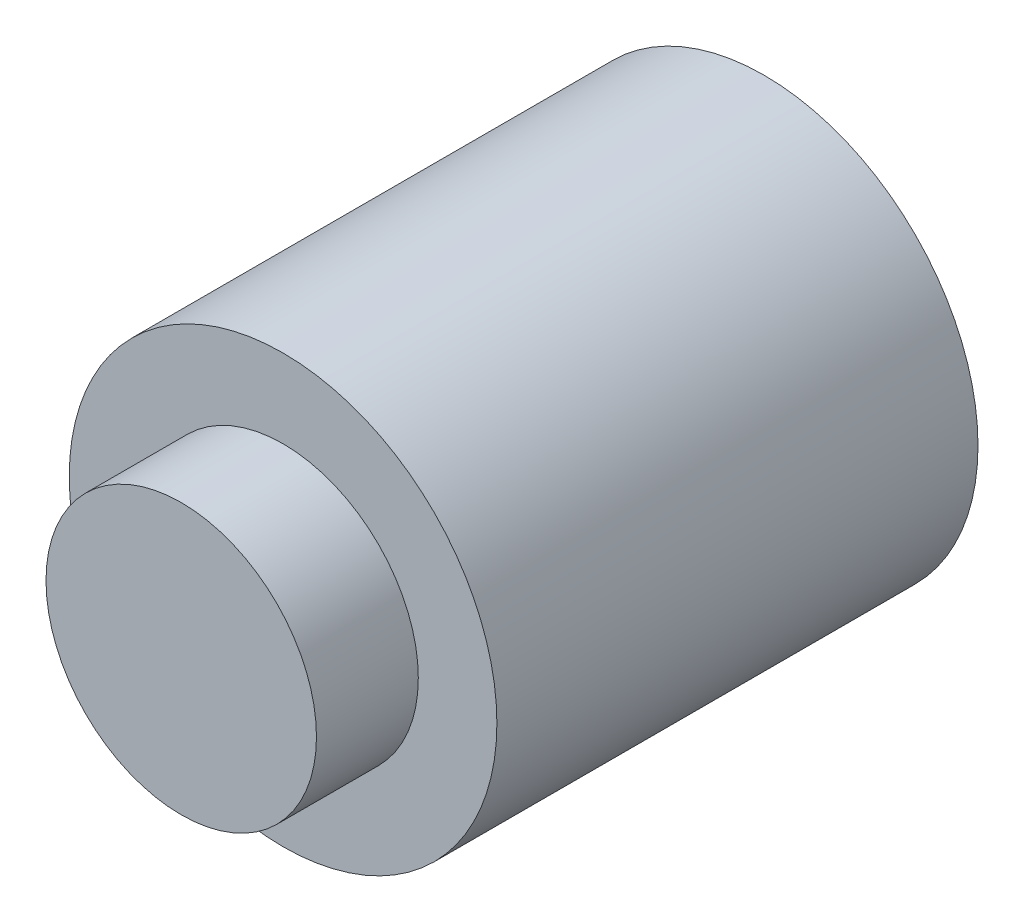
ISO-10303-21;
HEADER;
FILE_DESCRIPTION(('STEP AP214'),'2;1');
FILE_NAME('part.step','',(''),(''),'','','');
FILE_SCHEMA(('AUTOMOTIVE_DESIGN { 1 0 10303 214 1 1 1 1 }'));
ENDSEC;
DATA;
#1=APPLICATION_CONTEXT('core data for automotive mechanical design processes');
#2=APPLICATION_PROTOCOL_DEFINITION('international standard','automotive_design',2000,#1);
#3=PRODUCT_CONTEXT('',#1,'mechanical');
#4=PRODUCT('Part','Part','',(#3));
#5=PRODUCT_RELATED_PRODUCT_CATEGORY('part','',(#4));
#6=PRODUCT_DEFINITION_FORMATION('','',#4);
#7=PRODUCT_DEFINITION_CONTEXT('part definition',#1,'design');
#8=PRODUCT_DEFINITION('design','',#6,#7);
#9=PRODUCT_DEFINITION_SHAPE('','',#8);
#10=(LENGTH_UNIT() NAMED_UNIT(*) SI_UNIT(.MILLI.,.METRE.));
#11=(NAMED_UNIT(*) PLANE_ANGLE_UNIT() SI_UNIT($,.RADIAN.));
#12=(NAMED_UNIT(*) SI_UNIT($,.STERADIAN.) SOLID_ANGLE_UNIT());
#13=UNCERTAINTY_MEASURE_WITH_UNIT(LENGTH_MEASURE(1.E-05),#10,'distance_accuracy_value','');
#14=(GEOMETRIC_REPRESENTATION_CONTEXT(3) GLOBAL_UNCERTAINTY_ASSIGNED_CONTEXT((#13)) GLOBAL_UNIT_ASSIGNED_CONTEXT((#10,
#11,#12)) REPRESENTATION_CONTEXT('',''));
#15=CARTESIAN_POINT('',(0.,0.,0.));
#16=DIRECTION('',(0.,0.,1.));
#17=DIRECTION('',(1.,0.,0.));
#18=AXIS2_PLACEMENT_3D('',#15,#16,#17);
#19=CARTESIAN_POINT('',(0.,0.,0.));
#20=DIRECTION('',(0.,0.,1.));
#21=DIRECTION('',(0.,-1.,0.));
#22=AXIS2_PLACEMENT_3D('',#19,#20,#21);
#23=PLANE('',#22);
#24=CARTESIAN_POINT('',(0.,0.,0.));
#25=DIRECTION('',(0.,0.,-1.));
#26=DIRECTION('',(0.,1.,0.));
#27=AXIS2_PLACEMENT_3D('',#24,#25,#26);
#28=CIRCLE('',#27,12.6492);
#29=CARTESIAN_POINT('',(0.,12.6492,0.));
#30=VERTEX_POINT('',#29);
#31=EDGE_CURVE('E11',#30,#30,#28,.T.);
#32=ORIENTED_EDGE('',*,*,#31,.F.);
#33=EDGE_LOOP('',(#32));
#34=FACE_BOUND('',#33,.T.);
#35=ADVANCED_FACE('F50',(#34),#23,.T.);
#36=CARTESIAN_POINT('',(0.,0.,-19.525));
#37=DIRECTION('',(0.,0.,-1.));
#38=DIRECTION('',(0.,1.,0.));
#39=AXIS2_PLACEMENT_3D('',#36,#37,#38);
#40=CYLINDRICAL_SURFACE('',#39,12.6492);
#41=ORIENTED_EDGE('',*,*,#31,.T.);
#42=EDGE_LOOP('',(#41));
#43=FACE_BOUND('',#42,.T.);
#44=CARTESIAN_POINT('',(0.,0.,-9.525));
#45=DIRECTION('',(0.,0.,-1.));
#46=DIRECTION('',(0.,1.,0.));
#47=AXIS2_PLACEMENT_3D('',#44,#45,#46);
#48=CIRCLE('',#47,12.6492);
#49=CARTESIAN_POINT('',(0.,12.6492,-9.525));
#50=VERTEX_POINT('',#49);
#51=EDGE_CURVE('E58',#50,#50,#48,.T.);
#52=ORIENTED_EDGE('',*,*,#51,.F.);
#53=EDGE_LOOP('',(#52));
#54=FACE_BOUND('',#53,.T.);
#55=ADVANCED_FACE('F138',(#43,#54),#40,.T.);
#56=CARTESIAN_POINT('',(0.,12.6492,-9.525));
#57=DIRECTION('',(0.,0.,1.));
#58=DIRECTION('',(0.,-1.,0.));
#59=AXIS2_PLACEMENT_3D('',#56,#57,#58);
#60=PLANE('',#59);
#61=ORIENTED_EDGE('',*,*,#51,.T.);
#62=EDGE_LOOP('',(#61));
#63=FACE_BOUND('',#62,.T.);
#64=CARTESIAN_POINT('',(0.,0.,-9.525));
#65=DIRECTION('',(0.,0.,-1.));
#66=DIRECTION('',(0.,1.,0.));
#67=AXIS2_PLACEMENT_3D('',#64,#65,#66);
#68=CIRCLE('',#67,20.);
#69=CARTESIAN_POINT('',(0.,20.,-9.525));
#70=VERTEX_POINT('',#69);
#71=EDGE_CURVE('E128',#70,#70,#68,.T.);
#72=ORIENTED_EDGE('',*,*,#71,.F.);
#73=EDGE_LOOP('',(#72));
#74=FACE_BOUND('',#73,.T.);
#75=ADVANCED_FACE('F135',(#63,#74),#60,.T.);
#76=CARTESIAN_POINT('',(0.,0.,-19.525));
#77=DIRECTION('',(0.,0.,-1.));
#78=DIRECTION('',(0.,1.,0.));
#79=AXIS2_PLACEMENT_3D('',#76,#77,#78);
#80=CYLINDRICAL_SURFACE('',#79,20.);
#81=ORIENTED_EDGE('',*,*,#71,.T.);
#82=EDGE_LOOP('',(#81));
#83=FACE_BOUND('',#82,.T.);
#84=CARTESIAN_POINT('',(0.,0.,-54.525));
#85=DIRECTION('',(0.,0.,-1.));
#86=DIRECTION('',(0.,1.,0.));
#87=AXIS2_PLACEMENT_3D('',#84,#85,#86);
#88=CIRCLE('',#87,20.);
#89=CARTESIAN_POINT('',(0.,20.,-54.525));
#90=VERTEX_POINT('',#89);
#91=EDGE_CURVE('E124',#90,#90,#88,.T.);
#92=ORIENTED_EDGE('',*,*,#91,.F.);
#93=EDGE_LOOP('',(#92));
#94=FACE_BOUND('',#93,.T.);
#95=ADVANCED_FACE('F145',(#83,#94),#80,.T.);
#96=CARTESIAN_POINT('',(0.,20.,-54.525));
#97=DIRECTION('',(0.,0.,-1.));
#98=DIRECTION('',(0.,1.,0.));
#99=AXIS2_PLACEMENT_3D('',#96,#97,#98);
#100=PLANE('',#99);
#101=CARTESIAN_POINT('',(-0.223849370894547,16.8260110456742,-54.525));
#102=DIRECTION('',(0.,0.,-1.));
#103=DIRECTION('',(0.,1.,0.));
#104=AXIS2_PLACEMENT_3D('',#101,#102,#103);
#105=CIRCLE('',#104,1.13029999999999);
#106=CARTESIAN_POINT('',(-0.223849370894547,17.9563110456742,-54.525));
#107=VERTEX_POINT('',#106);
#108=EDGE_CURVE('E83',#107,#107,#105,.T.);
#109=ORIENTED_EDGE('',*,*,#108,.F.);
#110=EDGE_LOOP('',(#109));
#111=FACE_BOUND('',#110,.T.);
#112=CARTESIAN_POINT('',(0.,-16.8275,-54.525));
#113=DIRECTION('',(0.,0.,-1.));
#114=DIRECTION('',(0.,1.,0.));
#115=AXIS2_PLACEMENT_3D('',#112,#113,#114);
#116=CIRCLE('',#115,1.13029999999999);
#117=CARTESIAN_POINT('',(0.,-15.6972,-54.525));
#118=VERTEX_POINT('',#117);
#119=EDGE_CURVE('E82',#118,#118,#116,.T.);
#120=ORIENTED_EDGE('',*,*,#119,.F.);
#121=EDGE_LOOP('',(#120));
#122=FACE_BOUND('',#121,.T.);
#123=CARTESIAN_POINT('',(16.8275,0.,-54.525));
#124=DIRECTION('',(0.,0.,-1.));
#125=DIRECTION('',(0.,1.,0.));
#126=AXIS2_PLACEMENT_3D('',#123,#124,#125);
#127=CIRCLE('',#126,1.13029999999999);
#128=CARTESIAN_POINT('',(16.8275,1.13029999999999,-54.525));
#129=VERTEX_POINT('',#128);
#130=EDGE_CURVE('E96',#129,#129,#127,.T.);
#131=ORIENTED_EDGE('',*,*,#130,.F.);
#132=EDGE_LOOP('',(#131));
#133=FACE_BOUND('',#132,.T.);
#134=CARTESIAN_POINT('',(-16.8275,0.,-54.525));
#135=DIRECTION('',(0.,0.,-1.));
#136=DIRECTION('',(0.,1.,0.));
#137=AXIS2_PLACEMENT_3D('',#134,#135,#136);
#138=CIRCLE('',#137,1.13029999999999);
#139=CARTESIAN_POINT('',(-16.8275,1.13029999999999,-54.525));
#140=VERTEX_POINT('',#139);
#141=EDGE_CURVE('E104',#140,#140,#138,.T.);
#142=ORIENTED_EDGE('',*,*,#141,.F.);
#143=EDGE_LOOP('',(#142));
#144=FACE_BOUND('',#143,.T.);
#145=ORIENTED_EDGE('',*,*,#91,.T.);
#146=EDGE_LOOP('',(#145));
#147=FACE_BOUND('',#146,.T.);
#148=CARTESIAN_POINT('',(0.,0.,-54.525));
#149=DIRECTION('',(0.,0.,-1.));
#150=DIRECTION('',(0.,1.,0.));
#151=AXIS2_PLACEMENT_3D('',#148,#149,#150);
#152=CIRCLE('',#151,13.8867513459481);
#153=CARTESIAN_POINT('',(0.,13.8867513459481,-54.525));
#154=VERTEX_POINT('',#153);
#155=EDGE_CURVE('E120',#154,#154,#152,.T.);
#156=ORIENTED_EDGE('',*,*,#155,.F.);
#157=EDGE_LOOP('',(#156));
#158=FACE_BOUND('',#157,.T.);
#159=ADVANCED_FACE('F151',(#111,#122,#133,#144,#147,#158),#100,.T.);
#160=CARTESIAN_POINT('',(0.,0.,-49.525));
#161=DIRECTION('',(0.,0.,-1.));
#162=DIRECTION('',(0.,1.,0.));
#163=AXIS2_PLACEMENT_3D('',#160,#161,#162);
#164=CONICAL_SURFACE('',#163,11.,0.523598775598298);
#165=ORIENTED_EDGE('',*,*,#155,.T.);
#166=EDGE_LOOP('',(#165));
#167=FACE_BOUND('',#166,.T.);
#168=CARTESIAN_POINT('',(0.,0.,-49.525));
#169=DIRECTION('',(0.,0.,-1.));
#170=DIRECTION('',(0.,1.,0.));
#171=AXIS2_PLACEMENT_3D('',#168,#169,#170);
#172=CIRCLE('',#171,11.);
#173=CARTESIAN_POINT('',(0.,11.,-49.525));
#174=VERTEX_POINT('',#173);
#175=EDGE_CURVE('E116',#174,#174,#172,.T.);
#176=ORIENTED_EDGE('',*,*,#175,.F.);
#177=EDGE_LOOP('',(#176));
#178=FACE_BOUND('',#177,.T.);
#179=ADVANCED_FACE('F155',(#167,#178),#164,.F.);
#180=CARTESIAN_POINT('',(0.,0.,-19.525));
#181=DIRECTION('',(0.,0.,-1.));
#182=DIRECTION('',(0.,1.,0.));
#183=AXIS2_PLACEMENT_3D('',#180,#181,#182);
#184=CYLINDRICAL_SURFACE('',#183,11.);
#185=ORIENTED_EDGE('',*,*,#175,.T.);
#186=EDGE_LOOP('',(#185));
#187=FACE_BOUND('',#186,.T.);
#188=CARTESIAN_POINT('',(0.,0.,-19.525));
#189=DIRECTION('',(0.,0.,-1.));
#190=DIRECTION('',(0.,1.,0.));
#191=AXIS2_PLACEMENT_3D('',#188,#189,#190);
#192=CIRCLE('',#191,11.);
#193=CARTESIAN_POINT('',(0.,11.,-19.525));
#194=VERTEX_POINT('',#193);
#195=EDGE_CURVE('E112',#194,#194,#192,.T.);
#196=ORIENTED_EDGE('',*,*,#195,.F.);
#197=EDGE_LOOP('',(#196));
#198=FACE_BOUND('',#197,.T.);
#199=ADVANCED_FACE('F159',(#187,#198),#184,.F.);
#200=CARTESIAN_POINT('',(0.,11.,-19.525));
#201=DIRECTION('',(0.,0.,-1.));
#202=DIRECTION('',(0.,1.,0.));
#203=AXIS2_PLACEMENT_3D('',#200,#201,#202);
#204=PLANE('',#203);
#205=ORIENTED_EDGE('',*,*,#195,.T.);
#206=EDGE_LOOP('',(#205));
#207=FACE_BOUND('',#206,.T.);
#208=ADVANCED_FACE('F163',(#207),#204,.T.);
#209=CARTESIAN_POINT('',(-16.8275,0.,-45.));
#210=DIRECTION('',(0.,0.,-1.));
#211=DIRECTION('',(0.,1.,0.));
#212=AXIS2_PLACEMENT_3D('',#209,#210,#211);
#213=CONICAL_SURFACE('',#212,1.1303,1.02974425867665);
#214=CARTESIAN_POINT('',(-16.8275,0.,-44.3208472423131));
#215=VERTEX_POINT('',#214);
#216=VERTEX_LOOP('',#215);
#217=FACE_BOUND('',#216,.T.);
#218=CARTESIAN_POINT('',(-16.8275,0.,-45.));
#219=DIRECTION('',(0.,0.,-1.));
#220=DIRECTION('',(0.,1.,0.));
#221=AXIS2_PLACEMENT_3D('',#218,#219,#220);
#222=CIRCLE('',#221,1.1303);
#223=CARTESIAN_POINT('',(-16.8275,1.1303,-45.));
#224=VERTEX_POINT('',#223);
#225=EDGE_CURVE('E108',#224,#224,#222,.T.);
#226=ORIENTED_EDGE('',*,*,#225,.T.);
#227=EDGE_LOOP('',(#226));
#228=FACE_BOUND('',#227,.T.);
#229=ADVANCED_FACE('F167',(#217,#228),#213,.F.);
#230=CARTESIAN_POINT('',(-16.8275,0.,-54.525));
#231=DIRECTION('',(0.,0.,-1.));
#232=DIRECTION('',(0.,1.,0.));
#233=AXIS2_PLACEMENT_3D('',#230,#231,#232);
#234=CYLINDRICAL_SURFACE('',#233,1.13029999999999);
#235=ORIENTED_EDGE('',*,*,#225,.F.);
#236=EDGE_LOOP('',(#235));
#237=FACE_BOUND('',#236,.T.);
#238=ORIENTED_EDGE('',*,*,#141,.T.);
#239=EDGE_LOOP('',(#238));
#240=FACE_BOUND('',#239,.T.);
#241=ADVANCED_FACE('F171',(#237,#240),#234,.F.);
#242=CARTESIAN_POINT('',(16.8275,0.,-45.));
#243=DIRECTION('',(0.,0.,-1.));
#244=DIRECTION('',(0.,1.,0.));
#245=AXIS2_PLACEMENT_3D('',#242,#243,#244);
#246=CONICAL_SURFACE('',#245,1.1303,1.02974425867665);
#247=CARTESIAN_POINT('',(16.8275,0.,-44.3208472423131));
#248=VERTEX_POINT('',#247);
#249=VERTEX_LOOP('',#248);
#250=FACE_BOUND('',#249,.T.);
#251=CARTESIAN_POINT('',(16.8275,0.,-45.));
#252=DIRECTION('',(0.,0.,-1.));
#253=DIRECTION('',(0.,1.,0.));
#254=AXIS2_PLACEMENT_3D('',#251,#252,#253);
#255=CIRCLE('',#254,1.1303);
#256=CARTESIAN_POINT('',(16.8275,1.1303,-45.));
#257=VERTEX_POINT('',#256);
#258=EDGE_CURVE('E100',#257,#257,#255,.T.);
#259=ORIENTED_EDGE('',*,*,#258,.T.);
#260=EDGE_LOOP('',(#259));
#261=FACE_BOUND('',#260,.T.);
#262=ADVANCED_FACE('F174',(#250,#261),#246,.F.);
#263=CARTESIAN_POINT('',(16.8275,0.,-54.525));
#264=DIRECTION('',(0.,0.,-1.));
#265=DIRECTION('',(0.,1.,0.));
#266=AXIS2_PLACEMENT_3D('',#263,#264,#265);
#267=CYLINDRICAL_SURFACE('',#266,1.13029999999999);
#268=ORIENTED_EDGE('',*,*,#258,.F.);
#269=EDGE_LOOP('',(#268));
#270=FACE_BOUND('',#269,.T.);
#271=ORIENTED_EDGE('',*,*,#130,.T.);
#272=EDGE_LOOP('',(#271));
#273=FACE_BOUND('',#272,.T.);
#274=ADVANCED_FACE('F178',(#270,#273),#267,.F.);
#275=CARTESIAN_POINT('',(0.,-16.8275,-45.));
#276=DIRECTION('',(0.,0.,-1.));
#277=DIRECTION('',(0.,1.,0.));
#278=AXIS2_PLACEMENT_3D('',#275,#276,#277);
#279=CONICAL_SURFACE('',#278,1.1303,1.02974425867665);
#280=CARTESIAN_POINT('',(0.,-16.8275,-44.3208472423131));
#281=VERTEX_POINT('',#280);
#282=VERTEX_LOOP('',#281);
#283=FACE_BOUND('',#282,.T.);
#284=CARTESIAN_POINT('',(0.,-16.8275,-45.));
#285=DIRECTION('',(0.,0.,-1.));
#286=DIRECTION('',(0.,1.,0.));
#287=AXIS2_PLACEMENT_3D('',#284,#285,#286);
#288=CIRCLE('',#287,1.1303);
#289=CARTESIAN_POINT('',(0.,-15.6972,-45.));
#290=VERTEX_POINT('',#289);
#291=EDGE_CURVE('E88',#290,#290,#288,.T.);
#292=ORIENTED_EDGE('',*,*,#291,.T.);
#293=EDGE_LOOP('',(#292));
#294=FACE_BOUND('',#293,.T.);
#295=ADVANCED_FACE('F181',(#283,#294),#279,.F.);
#296=CARTESIAN_POINT('',(0.,-16.8275,-54.525));
#297=DIRECTION('',(0.,0.,-1.));
#298=DIRECTION('',(0.,1.,0.));
#299=AXIS2_PLACEMENT_3D('',#296,#297,#298);
#300=CYLINDRICAL_SURFACE('',#299,1.13029999999999);
#301=ORIENTED_EDGE('',*,*,#291,.F.);
#302=EDGE_LOOP('',(#301));
#303=FACE_BOUND('',#302,.T.);
#304=ORIENTED_EDGE('',*,*,#119,.T.);
#305=EDGE_LOOP('',(#304));
#306=FACE_BOUND('',#305,.T.);
#307=ADVANCED_FACE('F75',(#303,#306),#300,.F.);
#308=CARTESIAN_POINT('',(-0.223849370894547,16.8260110456742,-45.));
#309=DIRECTION('',(0.,0.,-1.));
#310=DIRECTION('',(0.,1.,0.));
#311=AXIS2_PLACEMENT_3D('',#308,#309,#310);
#312=CONICAL_SURFACE('',#311,1.1303,1.02974425867665);
#313=CARTESIAN_POINT('',(-0.22384937089455,16.8260110456742,-44.3208472423131));
#314=VERTEX_POINT('',#313);
#315=VERTEX_LOOP('',#314);
#316=FACE_BOUND('',#315,.T.);
#317=CARTESIAN_POINT('',(-0.223849370894547,16.8260110456742,-45.));
#318=DIRECTION('',(0.,0.,-1.));
#319=DIRECTION('',(0.,1.,0.));
#320=AXIS2_PLACEMENT_3D('',#317,#318,#319);
#321=CIRCLE('',#320,1.1303);
#322=CARTESIAN_POINT('',(-0.223849370894547,17.9563110456742,-45.));
#323=VERTEX_POINT('',#322);
#324=EDGE_CURVE('E79',#323,#323,#321,.T.);
#325=ORIENTED_EDGE('',*,*,#324,.T.);
#326=EDGE_LOOP('',(#325));
#327=FACE_BOUND('',#326,.T.);
#328=ADVANCED_FACE('F71',(#316,#327),#312,.F.);
#329=CARTESIAN_POINT('',(-0.223849370894547,16.8260110456742,-54.525));
#330=DIRECTION('',(0.,0.,-1.));
#331=DIRECTION('',(0.,1.,0.));
#332=AXIS2_PLACEMENT_3D('',#329,#330,#331);
#333=CYLINDRICAL_SURFACE('',#332,1.13029999999999);
#334=ORIENTED_EDGE('',*,*,#324,.F.);
#335=EDGE_LOOP('',(#334));
#336=FACE_BOUND('',#335,.T.);
#337=ORIENTED_EDGE('',*,*,#108,.T.);
#338=EDGE_LOOP('',(#337));
#339=FACE_BOUND('',#338,.T.);
#340=ADVANCED_FACE('F74',(#336,#339),#333,.F.);
#341=CLOSED_SHELL('',(#35,#55,#75,#95,#159,#179,#199,#208,#229,#241,#262,#274,#295,#307,#328,#340));
#342=MANIFOLD_SOLID_BREP('B2',#341);
#343=ADVANCED_BREP_SHAPE_REPRESENTATION('',(#18,#342),#14);
#344=SHAPE_DEFINITION_REPRESENTATION(#9,#343);
ENDSEC;
END-ISO-10303-21;
